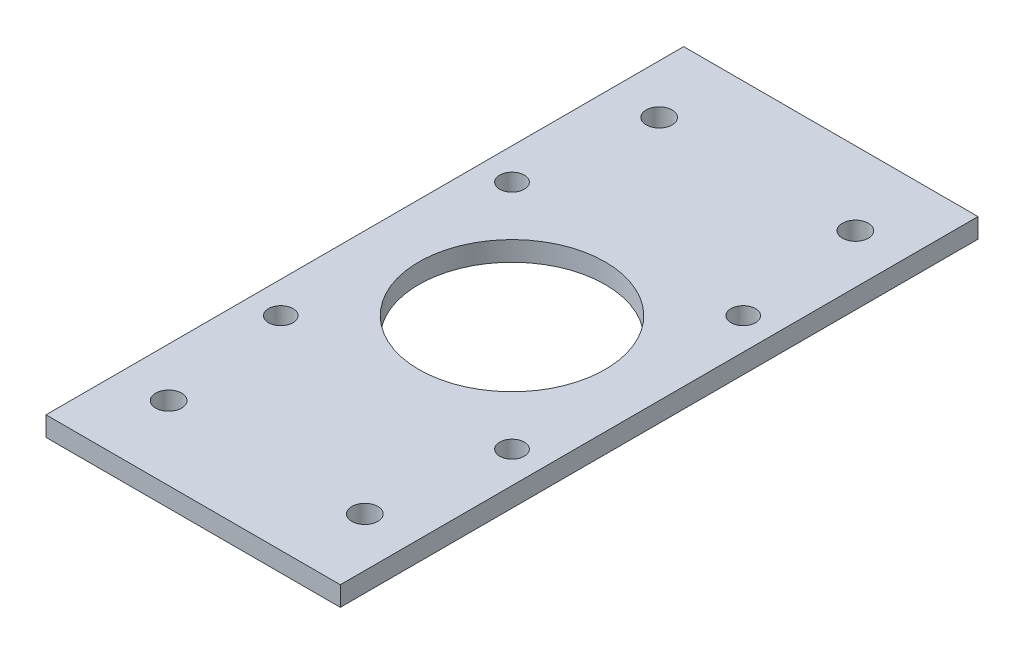
ISO-10303-21;
HEADER;
FILE_DESCRIPTION(('STEP AP214'),'2;1');
FILE_NAME('part.step','',(''),(''),'','','');
FILE_SCHEMA(('AUTOMOTIVE_DESIGN { 1 0 10303 214 1 1 1 1 }'));
ENDSEC;
DATA;
#1=APPLICATION_CONTEXT('core data for automotive mechanical design processes');
#2=APPLICATION_PROTOCOL_DEFINITION('international standard','automotive_design',2000,#1);
#3=PRODUCT_CONTEXT('',#1,'mechanical');
#4=PRODUCT('Part','Part','',(#3));
#5=PRODUCT_RELATED_PRODUCT_CATEGORY('part','',(#4));
#6=PRODUCT_DEFINITION_FORMATION('','',#4);
#7=PRODUCT_DEFINITION_CONTEXT('part definition',#1,'design');
#8=PRODUCT_DEFINITION('design','',#6,#7);
#9=PRODUCT_DEFINITION_SHAPE('','',#8);
#10=(LENGTH_UNIT() NAMED_UNIT(*) SI_UNIT(.MILLI.,.METRE.));
#11=(NAMED_UNIT(*) PLANE_ANGLE_UNIT() SI_UNIT($,.RADIAN.));
#12=(NAMED_UNIT(*) SI_UNIT($,.STERADIAN.) SOLID_ANGLE_UNIT());
#13=UNCERTAINTY_MEASURE_WITH_UNIT(LENGTH_MEASURE(1.E-05),#10,'distance_accuracy_value','');
#14=(GEOMETRIC_REPRESENTATION_CONTEXT(3) GLOBAL_UNCERTAINTY_ASSIGNED_CONTEXT((#13)) GLOBAL_UNIT_ASSIGNED_CONTEXT((#10,
#11,#12)) REPRESENTATION_CONTEXT('',''));
#15=CARTESIAN_POINT('',(0.,0.,0.));
#16=DIRECTION('',(0.,0.,1.));
#17=DIRECTION('',(1.,0.,0.));
#18=AXIS2_PLACEMENT_3D('',#15,#16,#17);
#19=CARTESIAN_POINT('',(30.,4.,65.));
#20=DIRECTION('',(-1.,0.,0.));
#21=DIRECTION('',(0.,0.,1.));
#22=AXIS2_PLACEMENT_3D('',#19,#20,#21);
#23=PLANE('',#22);
#24=DIRECTION('',(0.,0.,-1.));
#25=VECTOR('',#24,1.);
#26=CARTESIAN_POINT('',(30.,0.,65.));
#27=LINE('',#26,#25);
#28=CARTESIAN_POINT('',(30.,0.,65.));
#29=VERTEX_POINT('',#28);
#30=CARTESIAN_POINT('',(30.,0.,-65.));
#31=VERTEX_POINT('',#30);
#32=EDGE_CURVE('E95',#29,#31,#27,.T.);
#33=ORIENTED_EDGE('',*,*,#32,.T.);
#34=DIRECTION('',(0.,-1.,0.));
#35=VECTOR('',#34,1.);
#36=CARTESIAN_POINT('',(30.,4.,-65.));
#37=LINE('',#36,#35);
#38=CARTESIAN_POINT('',(30.,4.,-65.));
#39=VERTEX_POINT('',#38);
#40=EDGE_CURVE('E11',#39,#31,#37,.T.);
#41=ORIENTED_EDGE('',*,*,#40,.F.);
#42=DIRECTION('',(0.,0.,-1.));
#43=VECTOR('',#42,1.);
#44=CARTESIAN_POINT('',(30.,4.,65.));
#45=LINE('',#44,#43);
#46=CARTESIAN_POINT('',(30.,4.,65.));
#47=VERTEX_POINT('',#46);
#48=EDGE_CURVE('E83',#47,#39,#45,.T.);
#49=ORIENTED_EDGE('',*,*,#48,.F.);
#50=DIRECTION('',(0.,-1.,0.));
#51=VECTOR('',#50,1.);
#52=CARTESIAN_POINT('',(30.,4.,65.));
#53=LINE('',#52,#51);
#54=EDGE_CURVE('E91',#47,#29,#53,.T.);
#55=ORIENTED_EDGE('',*,*,#54,.T.);
#56=EDGE_LOOP('',(#33,#41,#49,#55));
#57=FACE_BOUND('',#56,.T.);
#58=ADVANCED_FACE('F32',(#57),#23,.F.);
#59=CARTESIAN_POINT('',(-30.,4.,-65.));
#60=DIRECTION('',(0.,0.,1.));
#61=DIRECTION('',(1.,0.,0.));
#62=AXIS2_PLACEMENT_3D('',#59,#60,#61);
#63=PLANE('',#62);
#64=DIRECTION('',(-1.,0.,0.));
#65=VECTOR('',#64,1.);
#66=CARTESIAN_POINT('',(-30.,0.,-65.));
#67=LINE('',#66,#65);
#68=CARTESIAN_POINT('',(-30.,0.,-65.));
#69=VERTEX_POINT('',#68);
#70=EDGE_CURVE('E87',#31,#69,#67,.T.);
#71=ORIENTED_EDGE('',*,*,#70,.T.);
#72=DIRECTION('',(0.,-1.,0.));
#73=VECTOR('',#72,1.);
#74=CARTESIAN_POINT('',(-30.,4.,-65.));
#75=LINE('',#74,#73);
#76=CARTESIAN_POINT('',(-30.,4.,-65.));
#77=VERTEX_POINT('',#76);
#78=EDGE_CURVE('E40',#77,#69,#75,.T.);
#79=ORIENTED_EDGE('',*,*,#78,.F.);
#80=DIRECTION('',(-1.,0.,0.));
#81=VECTOR('',#80,1.);
#82=CARTESIAN_POINT('',(-30.,4.,-65.));
#83=LINE('',#82,#81);
#84=EDGE_CURVE('E78',#39,#77,#83,.T.);
#85=ORIENTED_EDGE('',*,*,#84,.F.);
#86=ORIENTED_EDGE('',*,*,#40,.T.);
#87=EDGE_LOOP('',(#71,#79,#85,#86));
#88=FACE_BOUND('',#87,.T.);
#89=ADVANCED_FACE('F86',(#88),#63,.F.);
#90=CARTESIAN_POINT('',(-30.,4.,65.));
#91=DIRECTION('',(1.,0.,0.));
#92=DIRECTION('',(0.,0.,-1.));
#93=AXIS2_PLACEMENT_3D('',#90,#91,#92);
#94=PLANE('',#93);
#95=DIRECTION('',(0.,0.,1.));
#96=VECTOR('',#95,1.);
#97=CARTESIAN_POINT('',(-30.,0.,65.));
#98=LINE('',#97,#96);
#99=CARTESIAN_POINT('',(-30.,0.,65.));
#100=VERTEX_POINT('',#99);
#101=EDGE_CURVE('E65',#69,#100,#98,.T.);
#102=ORIENTED_EDGE('',*,*,#101,.T.);
#103=DIRECTION('',(0.,-1.,0.));
#104=VECTOR('',#103,1.);
#105=CARTESIAN_POINT('',(-30.,4.,65.));
#106=LINE('',#105,#104);
#107=CARTESIAN_POINT('',(-30.,4.,65.));
#108=VERTEX_POINT('',#107);
#109=EDGE_CURVE('E88',#108,#100,#106,.T.);
#110=ORIENTED_EDGE('',*,*,#109,.F.);
#111=DIRECTION('',(0.,0.,1.));
#112=VECTOR('',#111,1.);
#113=CARTESIAN_POINT('',(-30.,4.,65.));
#114=LINE('',#113,#112);
#115=EDGE_CURVE('E81',#77,#108,#114,.T.);
#116=ORIENTED_EDGE('',*,*,#115,.F.);
#117=ORIENTED_EDGE('',*,*,#78,.T.);
#118=EDGE_LOOP('',(#102,#110,#116,#117));
#119=FACE_BOUND('',#118,.T.);
#120=ADVANCED_FACE('F89',(#119),#94,.F.);
#121=CARTESIAN_POINT('',(-30.,4.,65.));
#122=DIRECTION('',(0.,0.,-1.));
#123=DIRECTION('',(-1.,0.,0.));
#124=AXIS2_PLACEMENT_3D('',#121,#122,#123);
#125=PLANE('',#124);
#126=DIRECTION('',(1.,0.,0.));
#127=VECTOR('',#126,1.);
#128=CARTESIAN_POINT('',(-30.,0.,65.));
#129=LINE('',#128,#127);
#130=EDGE_CURVE('E71',#100,#29,#129,.T.);
#131=ORIENTED_EDGE('',*,*,#130,.T.);
#132=ORIENTED_EDGE('',*,*,#54,.F.);
#133=DIRECTION('',(1.,0.,0.));
#134=VECTOR('',#133,1.);
#135=CARTESIAN_POINT('',(-30.,4.,65.));
#136=LINE('',#135,#134);
#137=EDGE_CURVE('E48',#108,#47,#136,.T.);
#138=ORIENTED_EDGE('',*,*,#137,.F.);
#139=ORIENTED_EDGE('',*,*,#109,.T.);
#140=EDGE_LOOP('',(#131,#132,#138,#139));
#141=FACE_BOUND('',#140,.T.);
#142=ADVANCED_FACE('F103',(#141),#125,.F.);
#143=CARTESIAN_POINT('',(0.,4.,0.));
#144=DIRECTION('',(0.,-1.,0.));
#145=DIRECTION('',(0.,0.,-1.));
#146=AXIS2_PLACEMENT_3D('',#143,#144,#145);
#147=PLANE('',#146);
#148=CARTESIAN_POINT('',(-20.,4.,50.));
#149=DIRECTION('',(0.,1.,0.));
#150=DIRECTION('',(0.,0.,1.));
#151=AXIS2_PLACEMENT_3D('',#148,#149,#150);
#152=CIRCLE('',#151,2.65);
#153=CARTESIAN_POINT('',(-20.,4.,52.65));
#154=VERTEX_POINT('',#153);
#155=EDGE_CURVE('E159',#154,#154,#152,.T.);
#156=ORIENTED_EDGE('',*,*,#155,.F.);
#157=EDGE_LOOP('',(#156));
#158=FACE_BOUND('',#157,.T.);
#159=CARTESIAN_POINT('',(20.,4.,50.));
#160=DIRECTION('',(0.,1.,0.));
#161=DIRECTION('',(0.,0.,1.));
#162=AXIS2_PLACEMENT_3D('',#159,#160,#161);
#163=CIRCLE('',#162,2.65);
#164=CARTESIAN_POINT('',(20.,4.,52.65));
#165=VERTEX_POINT('',#164);
#166=EDGE_CURVE('E153',#165,#165,#163,.T.);
#167=ORIENTED_EDGE('',*,*,#166,.F.);
#168=EDGE_LOOP('',(#167));
#169=FACE_BOUND('',#168,.T.);
#170=CARTESIAN_POINT('',(-20.,4.,-50.));
#171=DIRECTION('',(0.,1.,0.));
#172=DIRECTION('',(0.,0.,1.));
#173=AXIS2_PLACEMENT_3D('',#170,#171,#172);
#174=CIRCLE('',#173,2.65);
#175=CARTESIAN_POINT('',(-20.,4.,-47.35));
#176=VERTEX_POINT('',#175);
#177=EDGE_CURVE('E147',#176,#176,#174,.T.);
#178=ORIENTED_EDGE('',*,*,#177,.F.);
#179=EDGE_LOOP('',(#178));
#180=FACE_BOUND('',#179,.T.);
#181=CARTESIAN_POINT('',(20.,4.,-50.));
#182=DIRECTION('',(0.,1.,0.));
#183=DIRECTION('',(0.,0.,1.));
#184=AXIS2_PLACEMENT_3D('',#181,#182,#183);
#185=CIRCLE('',#184,2.65);
#186=CARTESIAN_POINT('',(20.,4.,-47.35));
#187=VERTEX_POINT('',#186);
#188=EDGE_CURVE('E141',#187,#187,#185,.T.);
#189=ORIENTED_EDGE('',*,*,#188,.F.);
#190=EDGE_LOOP('',(#189));
#191=FACE_BOUND('',#190,.T.);
#192=CARTESIAN_POINT('',(-23.57,4.,-23.57));
#193=DIRECTION('',(0.,1.,0.));
#194=DIRECTION('',(0.,0.,1.));
#195=AXIS2_PLACEMENT_3D('',#192,#193,#194);
#196=CIRCLE('',#195,2.5);
#197=CARTESIAN_POINT('',(-23.57,4.,-21.07));
#198=VERTEX_POINT('',#197);
#199=EDGE_CURVE('E134',#198,#198,#196,.T.);
#200=ORIENTED_EDGE('',*,*,#199,.F.);
#201=EDGE_LOOP('',(#200));
#202=FACE_BOUND('',#201,.T.);
#203=CARTESIAN_POINT('',(23.57,4.,-23.57));
#204=DIRECTION('',(0.,1.,0.));
#205=DIRECTION('',(0.,0.,1.));
#206=AXIS2_PLACEMENT_3D('',#203,#204,#205);
#207=CIRCLE('',#206,2.5);
#208=CARTESIAN_POINT('',(23.57,4.,-21.07));
#209=VERTEX_POINT('',#208);
#210=EDGE_CURVE('E128',#209,#209,#207,.T.);
#211=ORIENTED_EDGE('',*,*,#210,.F.);
#212=EDGE_LOOP('',(#211));
#213=FACE_BOUND('',#212,.T.);
#214=CARTESIAN_POINT('',(23.57,4.,23.57));
#215=DIRECTION('',(0.,1.,0.));
#216=DIRECTION('',(0.,0.,1.));
#217=AXIS2_PLACEMENT_3D('',#214,#215,#216);
#218=CIRCLE('',#217,2.5);
#219=CARTESIAN_POINT('',(23.57,4.,26.07));
#220=VERTEX_POINT('',#219);
#221=EDGE_CURVE('E122',#220,#220,#218,.T.);
#222=ORIENTED_EDGE('',*,*,#221,.F.);
#223=EDGE_LOOP('',(#222));
#224=FACE_BOUND('',#223,.T.);
#225=CARTESIAN_POINT('',(-23.57,4.,23.57));
#226=DIRECTION('',(0.,1.,0.));
#227=DIRECTION('',(0.,0.,1.));
#228=AXIS2_PLACEMENT_3D('',#225,#226,#227);
#229=CIRCLE('',#228,2.5);
#230=CARTESIAN_POINT('',(-23.57,4.,26.07));
#231=VERTEX_POINT('',#230);
#232=EDGE_CURVE('E115',#231,#231,#229,.T.);
#233=ORIENTED_EDGE('',*,*,#232,.F.);
#234=EDGE_LOOP('',(#233));
#235=FACE_BOUND('',#234,.T.);
#236=CARTESIAN_POINT('',(0.,4.,0.));
#237=DIRECTION('',(0.,1.,0.));
#238=DIRECTION('',(0.,0.,1.));
#239=AXIS2_PLACEMENT_3D('',#236,#237,#238);
#240=CIRCLE('',#239,19.);
#241=CARTESIAN_POINT('',(0.,4.,19.));
#242=VERTEX_POINT('',#241);
#243=EDGE_CURVE('E109',#242,#242,#240,.T.);
#244=ORIENTED_EDGE('',*,*,#243,.F.);
#245=EDGE_LOOP('',(#244));
#246=FACE_BOUND('',#245,.T.);
#247=ORIENTED_EDGE('',*,*,#48,.T.);
#248=ORIENTED_EDGE('',*,*,#84,.T.);
#249=ORIENTED_EDGE('',*,*,#115,.T.);
#250=ORIENTED_EDGE('',*,*,#137,.T.);
#251=EDGE_LOOP('',(#247,#248,#249,#250));
#252=FACE_BOUND('',#251,.T.);
#253=ADVANCED_FACE('F79',(#158,#169,#180,#191,#202,#213,#224,#235,#246,#252),#147,.F.);
#254=CARTESIAN_POINT('',(0.,0.,0.));
#255=DIRECTION('',(0.,-1.,0.));
#256=DIRECTION('',(0.,0.,-1.));
#257=AXIS2_PLACEMENT_3D('',#254,#255,#256);
#258=PLANE('',#257);
#259=CARTESIAN_POINT('',(-20.,0.,50.));
#260=DIRECTION('',(0.,1.,0.));
#261=DIRECTION('',(0.,0.,1.));
#262=AXIS2_PLACEMENT_3D('',#259,#260,#261);
#263=CIRCLE('',#262,2.65);
#264=CARTESIAN_POINT('',(-20.,0.,52.65));
#265=VERTEX_POINT('',#264);
#266=EDGE_CURVE('E156',#265,#265,#263,.T.);
#267=ORIENTED_EDGE('',*,*,#266,.T.);
#268=EDGE_LOOP('',(#267));
#269=FACE_BOUND('',#268,.T.);
#270=CARTESIAN_POINT('',(20.,0.,50.));
#271=DIRECTION('',(0.,1.,0.));
#272=DIRECTION('',(0.,0.,1.));
#273=AXIS2_PLACEMENT_3D('',#270,#271,#272);
#274=CIRCLE('',#273,2.65);
#275=CARTESIAN_POINT('',(20.,0.,52.65));
#276=VERTEX_POINT('',#275);
#277=EDGE_CURVE('E150',#276,#276,#274,.T.);
#278=ORIENTED_EDGE('',*,*,#277,.T.);
#279=EDGE_LOOP('',(#278));
#280=FACE_BOUND('',#279,.T.);
#281=CARTESIAN_POINT('',(-20.,0.,-50.));
#282=DIRECTION('',(0.,1.,0.));
#283=DIRECTION('',(0.,0.,1.));
#284=AXIS2_PLACEMENT_3D('',#281,#282,#283);
#285=CIRCLE('',#284,2.65);
#286=CARTESIAN_POINT('',(-20.,0.,-47.35));
#287=VERTEX_POINT('',#286);
#288=EDGE_CURVE('E144',#287,#287,#285,.T.);
#289=ORIENTED_EDGE('',*,*,#288,.T.);
#290=EDGE_LOOP('',(#289));
#291=FACE_BOUND('',#290,.T.);
#292=CARTESIAN_POINT('',(20.,0.,-50.));
#293=DIRECTION('',(0.,1.,0.));
#294=DIRECTION('',(0.,0.,1.));
#295=AXIS2_PLACEMENT_3D('',#292,#293,#294);
#296=CIRCLE('',#295,2.65);
#297=CARTESIAN_POINT('',(20.,0.,-47.35));
#298=VERTEX_POINT('',#297);
#299=EDGE_CURVE('E119',#298,#298,#296,.T.);
#300=ORIENTED_EDGE('',*,*,#299,.T.);
#301=EDGE_LOOP('',(#300));
#302=FACE_BOUND('',#301,.T.);
#303=CARTESIAN_POINT('',(-23.57,0.,-23.57));
#304=DIRECTION('',(0.,1.,0.));
#305=DIRECTION('',(0.,0.,1.));
#306=AXIS2_PLACEMENT_3D('',#303,#304,#305);
#307=CIRCLE('',#306,2.5);
#308=CARTESIAN_POINT('',(-23.57,0.,-21.07));
#309=VERTEX_POINT('',#308);
#310=EDGE_CURVE('E112',#309,#309,#307,.T.);
#311=ORIENTED_EDGE('',*,*,#310,.T.);
#312=EDGE_LOOP('',(#311));
#313=FACE_BOUND('',#312,.T.);
#314=CARTESIAN_POINT('',(23.57,0.,-23.57));
#315=DIRECTION('',(0.,1.,0.));
#316=DIRECTION('',(0.,0.,1.));
#317=AXIS2_PLACEMENT_3D('',#314,#315,#316);
#318=CIRCLE('',#317,2.5);
#319=CARTESIAN_POINT('',(23.57,0.,-21.07));
#320=VERTEX_POINT('',#319);
#321=EDGE_CURVE('E131',#320,#320,#318,.T.);
#322=ORIENTED_EDGE('',*,*,#321,.T.);
#323=EDGE_LOOP('',(#322));
#324=FACE_BOUND('',#323,.T.);
#325=CARTESIAN_POINT('',(23.57,0.,23.57));
#326=DIRECTION('',(0.,1.,0.));
#327=DIRECTION('',(0.,0.,1.));
#328=AXIS2_PLACEMENT_3D('',#325,#326,#327);
#329=CIRCLE('',#328,2.5);
#330=CARTESIAN_POINT('',(23.57,0.,26.07));
#331=VERTEX_POINT('',#330);
#332=EDGE_CURVE('E125',#331,#331,#329,.T.);
#333=ORIENTED_EDGE('',*,*,#332,.T.);
#334=EDGE_LOOP('',(#333));
#335=FACE_BOUND('',#334,.T.);
#336=CARTESIAN_POINT('',(-23.57,0.,23.57));
#337=DIRECTION('',(0.,1.,0.));
#338=DIRECTION('',(0.,0.,1.));
#339=AXIS2_PLACEMENT_3D('',#336,#337,#338);
#340=CIRCLE('',#339,2.5);
#341=CARTESIAN_POINT('',(-23.57,0.,26.07));
#342=VERTEX_POINT('',#341);
#343=EDGE_CURVE('E118',#342,#342,#340,.T.);
#344=ORIENTED_EDGE('',*,*,#343,.T.);
#345=EDGE_LOOP('',(#344));
#346=FACE_BOUND('',#345,.T.);
#347=CARTESIAN_POINT('',(0.,0.,0.));
#348=DIRECTION('',(0.,1.,0.));
#349=DIRECTION('',(0.,0.,1.));
#350=AXIS2_PLACEMENT_3D('',#347,#348,#349);
#351=CIRCLE('',#350,19.);
#352=CARTESIAN_POINT('',(0.,0.,19.));
#353=VERTEX_POINT('',#352);
#354=EDGE_CURVE('E98',#353,#353,#351,.T.);
#355=ORIENTED_EDGE('',*,*,#354,.T.);
#356=EDGE_LOOP('',(#355));
#357=FACE_BOUND('',#356,.T.);
#358=ORIENTED_EDGE('',*,*,#32,.F.);
#359=ORIENTED_EDGE('',*,*,#130,.F.);
#360=ORIENTED_EDGE('',*,*,#101,.F.);
#361=ORIENTED_EDGE('',*,*,#70,.F.);
#362=EDGE_LOOP('',(#358,#359,#360,#361));
#363=FACE_BOUND('',#362,.T.);
#364=ADVANCED_FACE('F106',(#269,#280,#291,#302,#313,#324,#335,#346,#357,#363),#258,.T.);
#365=CARTESIAN_POINT('',(0.,0.,0.));
#366=DIRECTION('',(0.,1.,0.));
#367=DIRECTION('',(0.,0.,1.));
#368=AXIS2_PLACEMENT_3D('',#365,#366,#367);
#369=CYLINDRICAL_SURFACE('',#368,19.);
#370=ORIENTED_EDGE('',*,*,#354,.F.);
#371=EDGE_LOOP('',(#370));
#372=FACE_BOUND('',#371,.T.);
#373=ORIENTED_EDGE('',*,*,#243,.T.);
#374=EDGE_LOOP('',(#373));
#375=FACE_BOUND('',#374,.T.);
#376=ADVANCED_FACE('F184',(#372,#375),#369,.F.);
#377=CARTESIAN_POINT('',(-23.57,0.,23.57));
#378=DIRECTION('',(0.,1.,0.));
#379=DIRECTION('',(0.,0.,1.));
#380=AXIS2_PLACEMENT_3D('',#377,#378,#379);
#381=CYLINDRICAL_SURFACE('',#380,2.5);
#382=ORIENTED_EDGE('',*,*,#343,.F.);
#383=EDGE_LOOP('',(#382));
#384=FACE_BOUND('',#383,.T.);
#385=ORIENTED_EDGE('',*,*,#232,.T.);
#386=EDGE_LOOP('',(#385));
#387=FACE_BOUND('',#386,.T.);
#388=ADVANCED_FACE('F186',(#384,#387),#381,.F.);
#389=CARTESIAN_POINT('',(23.57,0.,23.57));
#390=DIRECTION('',(0.,1.,0.));
#391=DIRECTION('',(0.,0.,1.));
#392=AXIS2_PLACEMENT_3D('',#389,#390,#391);
#393=CYLINDRICAL_SURFACE('',#392,2.5);
#394=ORIENTED_EDGE('',*,*,#332,.F.);
#395=EDGE_LOOP('',(#394));
#396=FACE_BOUND('',#395,.T.);
#397=ORIENTED_EDGE('',*,*,#221,.T.);
#398=EDGE_LOOP('',(#397));
#399=FACE_BOUND('',#398,.T.);
#400=ADVANCED_FACE('F193',(#396,#399),#393,.F.);
#401=CARTESIAN_POINT('',(23.57,0.,-23.57));
#402=DIRECTION('',(0.,1.,0.));
#403=DIRECTION('',(0.,0.,1.));
#404=AXIS2_PLACEMENT_3D('',#401,#402,#403);
#405=CYLINDRICAL_SURFACE('',#404,2.5);
#406=ORIENTED_EDGE('',*,*,#321,.F.);
#407=EDGE_LOOP('',(#406));
#408=FACE_BOUND('',#407,.T.);
#409=ORIENTED_EDGE('',*,*,#210,.T.);
#410=EDGE_LOOP('',(#409));
#411=FACE_BOUND('',#410,.T.);
#412=ADVANCED_FACE('F272',(#408,#411),#405,.F.);
#413=CARTESIAN_POINT('',(-23.57,0.,-23.57));
#414=DIRECTION('',(0.,1.,0.));
#415=DIRECTION('',(0.,0.,1.));
#416=AXIS2_PLACEMENT_3D('',#413,#414,#415);
#417=CYLINDRICAL_SURFACE('',#416,2.5);
#418=ORIENTED_EDGE('',*,*,#310,.F.);
#419=EDGE_LOOP('',(#418));
#420=FACE_BOUND('',#419,.T.);
#421=ORIENTED_EDGE('',*,*,#199,.T.);
#422=EDGE_LOOP('',(#421));
#423=FACE_BOUND('',#422,.T.);
#424=ADVANCED_FACE('F234',(#420,#423),#417,.F.);
#425=CARTESIAN_POINT('',(20.,4.,-50.));
#426=DIRECTION('',(0.,1.,0.));
#427=DIRECTION('',(0.,0.,1.));
#428=AXIS2_PLACEMENT_3D('',#425,#426,#427);
#429=CYLINDRICAL_SURFACE('',#428,2.65);
#430=ORIENTED_EDGE('',*,*,#299,.F.);
#431=EDGE_LOOP('',(#430));
#432=FACE_BOUND('',#431,.T.);
#433=ORIENTED_EDGE('',*,*,#188,.T.);
#434=EDGE_LOOP('',(#433));
#435=FACE_BOUND('',#434,.T.);
#436=ADVANCED_FACE('F228',(#432,#435),#429,.F.);
#437=CARTESIAN_POINT('',(-20.,4.,-50.));
#438=DIRECTION('',(0.,1.,0.));
#439=DIRECTION('',(0.,0.,1.));
#440=AXIS2_PLACEMENT_3D('',#437,#438,#439);
#441=CYLINDRICAL_SURFACE('',#440,2.65);
#442=ORIENTED_EDGE('',*,*,#288,.F.);
#443=EDGE_LOOP('',(#442));
#444=FACE_BOUND('',#443,.T.);
#445=ORIENTED_EDGE('',*,*,#177,.T.);
#446=EDGE_LOOP('',(#445));
#447=FACE_BOUND('',#446,.T.);
#448=ADVANCED_FACE('F233',(#444,#447),#441,.F.);
#449=CARTESIAN_POINT('',(20.,4.,50.));
#450=DIRECTION('',(0.,1.,0.));
#451=DIRECTION('',(0.,0.,1.));
#452=AXIS2_PLACEMENT_3D('',#449,#450,#451);
#453=CYLINDRICAL_SURFACE('',#452,2.65);
#454=ORIENTED_EDGE('',*,*,#277,.F.);
#455=EDGE_LOOP('',(#454));
#456=FACE_BOUND('',#455,.T.);
#457=ORIENTED_EDGE('',*,*,#166,.T.);
#458=EDGE_LOOP('',(#457));
#459=FACE_BOUND('',#458,.T.);
#460=ADVANCED_FACE('F246',(#456,#459),#453,.F.);
#461=CARTESIAN_POINT('',(-20.,4.,50.));
#462=DIRECTION('',(0.,1.,0.));
#463=DIRECTION('',(0.,0.,1.));
#464=AXIS2_PLACEMENT_3D('',#461,#462,#463);
#465=CYLINDRICAL_SURFACE('',#464,2.65);
#466=ORIENTED_EDGE('',*,*,#266,.F.);
#467=EDGE_LOOP('',(#466));
#468=FACE_BOUND('',#467,.T.);
#469=ORIENTED_EDGE('',*,*,#155,.T.);
#470=EDGE_LOOP('',(#469));
#471=FACE_BOUND('',#470,.T.);
#472=ADVANCED_FACE('F163',(#468,#471),#465,.F.);
#473=CLOSED_SHELL('',(#58,#89,#120,#142,#253,#364,#376,#388,#400,#412,#424,#436,#448,#460,#472));
#474=MANIFOLD_SOLID_BREP('B2',#473);
#475=ADVANCED_BREP_SHAPE_REPRESENTATION('',(#18,#474),#14);
#476=SHAPE_DEFINITION_REPRESENTATION(#9,#475);
ENDSEC;
END-ISO-10303-21;
